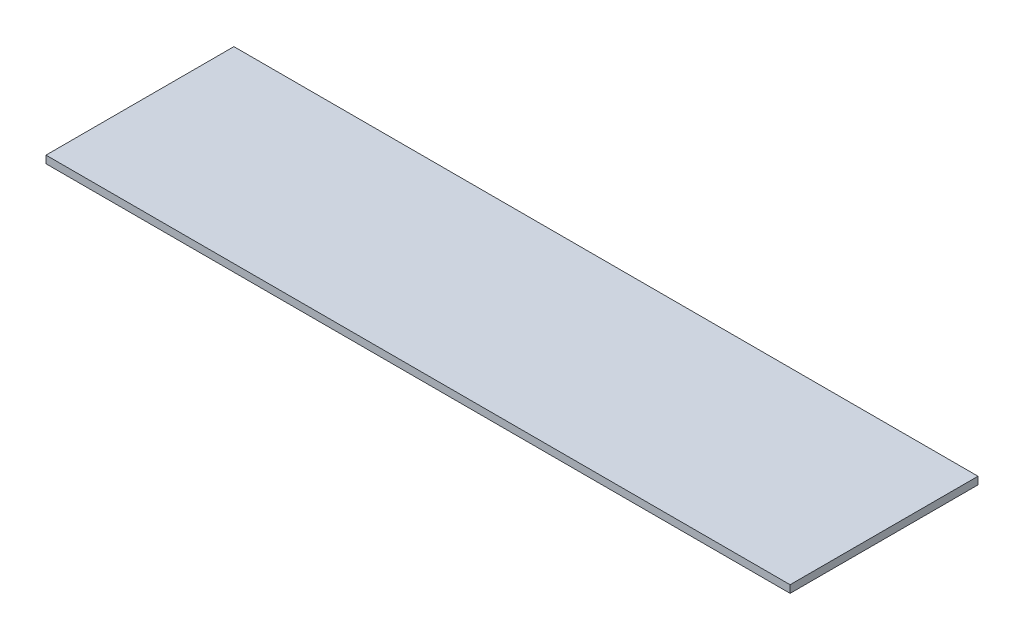
ISO-10303-21;
HEADER;
FILE_DESCRIPTION(('STEP AP214'),'2;1');
FILE_NAME('part.step','',(''),(''),'','','');
FILE_SCHEMA(('AUTOMOTIVE_DESIGN { 1 0 10303 214 1 1 1 1 }'));
ENDSEC;
DATA;
#1=APPLICATION_CONTEXT('core data for automotive mechanical design processes');
#2=APPLICATION_PROTOCOL_DEFINITION('international standard','automotive_design',2000,#1);
#3=PRODUCT_CONTEXT('',#1,'mechanical');
#4=PRODUCT('Part','Part','',(#3));
#5=PRODUCT_RELATED_PRODUCT_CATEGORY('part','',(#4));
#6=PRODUCT_DEFINITION_FORMATION('','',#4);
#7=PRODUCT_DEFINITION_CONTEXT('part definition',#1,'design');
#8=PRODUCT_DEFINITION('design','',#6,#7);
#9=PRODUCT_DEFINITION_SHAPE('','',#8);
#10=(LENGTH_UNIT() NAMED_UNIT(*) SI_UNIT(.MILLI.,.METRE.));
#11=(NAMED_UNIT(*) PLANE_ANGLE_UNIT() SI_UNIT($,.RADIAN.));
#12=(NAMED_UNIT(*) SI_UNIT($,.STERADIAN.) SOLID_ANGLE_UNIT());
#13=UNCERTAINTY_MEASURE_WITH_UNIT(LENGTH_MEASURE(1.E-05),#10,'distance_accuracy_value','');
#14=(GEOMETRIC_REPRESENTATION_CONTEXT(3) GLOBAL_UNCERTAINTY_ASSIGNED_CONTEXT((#13)) GLOBAL_UNIT_ASSIGNED_CONTEXT((#10,
#11,#12)) REPRESENTATION_CONTEXT('',''));
#15=CARTESIAN_POINT('',(0.,0.,0.));
#16=DIRECTION('',(0.,0.,1.));
#17=DIRECTION('',(1.,0.,0.));
#18=AXIS2_PLACEMENT_3D('',#15,#16,#17);
#19=CARTESIAN_POINT('',(0.,10.,0.));
#20=DIRECTION('',(1.,0.,0.));
#21=DIRECTION('',(0.,0.,-1.));
#22=AXIS2_PLACEMENT_3D('',#19,#20,#21);
#23=PLANE('',#22);
#24=DIRECTION('',(0.,0.,1.));
#25=VECTOR('',#24,1.);
#26=CARTESIAN_POINT('',(0.,0.,0.));
#27=LINE('',#26,#25);
#28=CARTESIAN_POINT('',(0.,0.,-250.));
#29=VERTEX_POINT('',#28);
#30=CARTESIAN_POINT('',(0.,0.,0.));
#31=VERTEX_POINT('',#30);
#32=EDGE_CURVE('E98',#29,#31,#27,.T.);
#33=ORIENTED_EDGE('',*,*,#32,.T.);
#34=DIRECTION('',(0.,-1.,0.));
#35=VECTOR('',#34,1.);
#36=CARTESIAN_POINT('',(0.,10.,0.));
#37=LINE('',#36,#35);
#38=CARTESIAN_POINT('',(0.,10.,0.));
#39=VERTEX_POINT('',#38);
#40=EDGE_CURVE('E11',#39,#31,#37,.T.);
#41=ORIENTED_EDGE('',*,*,#40,.F.);
#42=DIRECTION('',(0.,0.,1.));
#43=VECTOR('',#42,1.);
#44=CARTESIAN_POINT('',(0.,10.,0.));
#45=LINE('',#44,#43);
#46=CARTESIAN_POINT('',(0.,10.,-250.));
#47=VERTEX_POINT('',#46);
#48=EDGE_CURVE('E86',#47,#39,#45,.T.);
#49=ORIENTED_EDGE('',*,*,#48,.F.);
#50=DIRECTION('',(0.,-1.,0.));
#51=VECTOR('',#50,1.);
#52=CARTESIAN_POINT('',(0.,10.,-250.));
#53=LINE('',#52,#51);
#54=EDGE_CURVE('E94',#47,#29,#53,.T.);
#55=ORIENTED_EDGE('',*,*,#54,.T.);
#56=EDGE_LOOP('',(#33,#41,#49,#55));
#57=FACE_BOUND('',#56,.T.);
#58=ADVANCED_FACE('F35',(#57),#23,.F.);
#59=CARTESIAN_POINT('',(0.,10.,0.));
#60=DIRECTION('',(0.,0.,-1.));
#61=DIRECTION('',(-1.,0.,0.));
#62=AXIS2_PLACEMENT_3D('',#59,#60,#61);
#63=PLANE('',#62);
#64=DIRECTION('',(1.,0.,0.));
#65=VECTOR('',#64,1.);
#66=CARTESIAN_POINT('',(0.,0.,0.));
#67=LINE('',#66,#65);
#68=CARTESIAN_POINT('',(990.,0.,0.));
#69=VERTEX_POINT('',#68);
#70=EDGE_CURVE('E90',#31,#69,#67,.T.);
#71=ORIENTED_EDGE('',*,*,#70,.T.);
#72=DIRECTION('',(0.,-1.,0.));
#73=VECTOR('',#72,1.);
#74=CARTESIAN_POINT('',(990.,10.,0.));
#75=LINE('',#74,#73);
#76=CARTESIAN_POINT('',(990.,10.,0.));
#77=VERTEX_POINT('',#76);
#78=EDGE_CURVE('E43',#77,#69,#75,.T.);
#79=ORIENTED_EDGE('',*,*,#78,.F.);
#80=DIRECTION('',(1.,0.,0.));
#81=VECTOR('',#80,1.);
#82=CARTESIAN_POINT('',(0.,10.,0.));
#83=LINE('',#82,#81);
#84=EDGE_CURVE('E81',#39,#77,#83,.T.);
#85=ORIENTED_EDGE('',*,*,#84,.F.);
#86=ORIENTED_EDGE('',*,*,#40,.T.);
#87=EDGE_LOOP('',(#71,#79,#85,#86));
#88=FACE_BOUND('',#87,.T.);
#89=ADVANCED_FACE('F89',(#88),#63,.F.);
#90=CARTESIAN_POINT('',(990.,10.,0.));
#91=DIRECTION('',(-1.,0.,0.));
#92=DIRECTION('',(0.,0.,1.));
#93=AXIS2_PLACEMENT_3D('',#90,#91,#92);
#94=PLANE('',#93);
#95=DIRECTION('',(0.,0.,-1.));
#96=VECTOR('',#95,1.);
#97=CARTESIAN_POINT('',(990.,0.,0.));
#98=LINE('',#97,#96);
#99=CARTESIAN_POINT('',(990.,0.,-250.));
#100=VERTEX_POINT('',#99);
#101=EDGE_CURVE('E68',#69,#100,#98,.T.);
#102=ORIENTED_EDGE('',*,*,#101,.T.);
#103=DIRECTION('',(0.,-1.,0.));
#104=VECTOR('',#103,1.);
#105=CARTESIAN_POINT('',(990.,10.,-250.));
#106=LINE('',#105,#104);
#107=CARTESIAN_POINT('',(990.,10.,-250.));
#108=VERTEX_POINT('',#107);
#109=EDGE_CURVE('E91',#108,#100,#106,.T.);
#110=ORIENTED_EDGE('',*,*,#109,.F.);
#111=DIRECTION('',(0.,0.,-1.));
#112=VECTOR('',#111,1.);
#113=CARTESIAN_POINT('',(990.,10.,0.));
#114=LINE('',#113,#112);
#115=EDGE_CURVE('E84',#77,#108,#114,.T.);
#116=ORIENTED_EDGE('',*,*,#115,.F.);
#117=ORIENTED_EDGE('',*,*,#78,.T.);
#118=EDGE_LOOP('',(#102,#110,#116,#117));
#119=FACE_BOUND('',#118,.T.);
#120=ADVANCED_FACE('F92',(#119),#94,.F.);
#121=CARTESIAN_POINT('',(0.,10.,-250.));
#122=DIRECTION('',(0.,0.,1.));
#123=DIRECTION('',(1.,0.,0.));
#124=AXIS2_PLACEMENT_3D('',#121,#122,#123);
#125=PLANE('',#124);
#126=DIRECTION('',(-1.,0.,0.));
#127=VECTOR('',#126,1.);
#128=CARTESIAN_POINT('',(0.,0.,-250.));
#129=LINE('',#128,#127);
#130=EDGE_CURVE('E74',#100,#29,#129,.T.);
#131=ORIENTED_EDGE('',*,*,#130,.T.);
#132=ORIENTED_EDGE('',*,*,#54,.F.);
#133=DIRECTION('',(-1.,0.,0.));
#134=VECTOR('',#133,1.);
#135=CARTESIAN_POINT('',(0.,10.,-250.));
#136=LINE('',#135,#134);
#137=EDGE_CURVE('E51',#108,#47,#136,.T.);
#138=ORIENTED_EDGE('',*,*,#137,.F.);
#139=ORIENTED_EDGE('',*,*,#109,.T.);
#140=EDGE_LOOP('',(#131,#132,#138,#139));
#141=FACE_BOUND('',#140,.T.);
#142=ADVANCED_FACE('F105',(#141),#125,.F.);
#143=CARTESIAN_POINT('',(0.,10.,0.));
#144=DIRECTION('',(0.,-1.,0.));
#145=DIRECTION('',(0.,0.,-1.));
#146=AXIS2_PLACEMENT_3D('',#143,#144,#145);
#147=PLANE('',#146);
#148=ORIENTED_EDGE('',*,*,#48,.T.);
#149=ORIENTED_EDGE('',*,*,#84,.T.);
#150=ORIENTED_EDGE('',*,*,#115,.T.);
#151=ORIENTED_EDGE('',*,*,#137,.T.);
#152=EDGE_LOOP('',(#148,#149,#150,#151));
#153=FACE_BOUND('',#152,.T.);
#154=ADVANCED_FACE('F82',(#153),#147,.F.);
#155=CARTESIAN_POINT('',(0.,0.,0.));
#156=DIRECTION('',(0.,-1.,0.));
#157=DIRECTION('',(0.,0.,-1.));
#158=AXIS2_PLACEMENT_3D('',#155,#156,#157);
#159=PLANE('',#158);
#160=ORIENTED_EDGE('',*,*,#32,.F.);
#161=ORIENTED_EDGE('',*,*,#130,.F.);
#162=ORIENTED_EDGE('',*,*,#101,.F.);
#163=ORIENTED_EDGE('',*,*,#70,.F.);
#164=EDGE_LOOP('',(#160,#161,#162,#163));
#165=FACE_BOUND('',#164,.T.);
#166=ADVANCED_FACE('F108',(#165),#159,.T.);
#167=CLOSED_SHELL('',(#58,#89,#120,#142,#154,#166));
#168=MANIFOLD_SOLID_BREP('B2',#167);
#169=ADVANCED_BREP_SHAPE_REPRESENTATION('',(#18,#168),#14);
#170=SHAPE_DEFINITION_REPRESENTATION(#9,#169);
ENDSEC;
END-ISO-10303-21;
